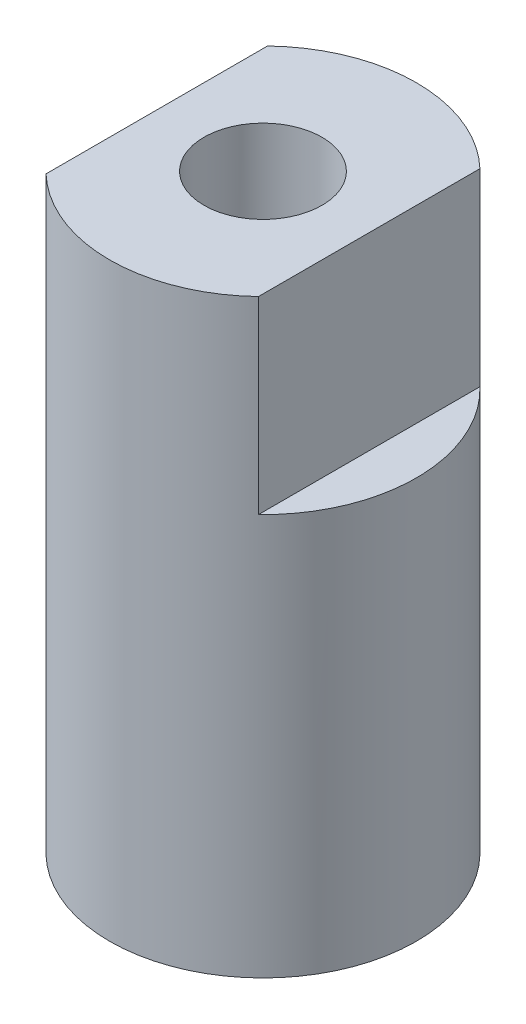
ISO-10303-21;
HEADER;
FILE_DESCRIPTION(('STEP AP214'),'2;1');
FILE_NAME('part.step','',(''),(''),'','','');
FILE_SCHEMA(('AUTOMOTIVE_DESIGN { 1 0 10303 214 1 1 1 1 }'));
ENDSEC;
DATA;
#1=APPLICATION_CONTEXT('core data for automotive mechanical design processes');
#2=APPLICATION_PROTOCOL_DEFINITION('international standard','automotive_design',2000,#1);
#3=PRODUCT_CONTEXT('',#1,'mechanical');
#4=PRODUCT('Part','Part','',(#3));
#5=PRODUCT_RELATED_PRODUCT_CATEGORY('part','',(#4));
#6=PRODUCT_DEFINITION_FORMATION('','',#4);
#7=PRODUCT_DEFINITION_CONTEXT('part definition',#1,'design');
#8=PRODUCT_DEFINITION('design','',#6,#7);
#9=PRODUCT_DEFINITION_SHAPE('','',#8);
#10=(LENGTH_UNIT() NAMED_UNIT(*) SI_UNIT(.MILLI.,.METRE.));
#11=(NAMED_UNIT(*) PLANE_ANGLE_UNIT() SI_UNIT($,.RADIAN.));
#12=(NAMED_UNIT(*) SI_UNIT($,.STERADIAN.) SOLID_ANGLE_UNIT());
#13=UNCERTAINTY_MEASURE_WITH_UNIT(LENGTH_MEASURE(1.E-05),#10,'distance_accuracy_value','');
#14=(GEOMETRIC_REPRESENTATION_CONTEXT(3) GLOBAL_UNCERTAINTY_ASSIGNED_CONTEXT((#13)) GLOBAL_UNIT_ASSIGNED_CONTEXT((#10,
#11,#12)) REPRESENTATION_CONTEXT('',''));
#15=CARTESIAN_POINT('',(0.,0.,0.));
#16=DIRECTION('',(0.,0.,1.));
#17=DIRECTION('',(1.,0.,0.));
#18=AXIS2_PLACEMENT_3D('',#15,#16,#17);
#19=CARTESIAN_POINT('',(0.,10.,0.));
#20=DIRECTION('',(0.,1.,0.));
#21=DIRECTION('',(0.,0.,1.));
#22=AXIS2_PLACEMENT_3D('',#19,#20,#21);
#23=CYLINDRICAL_SURFACE('',#22,0.999999999999999);
#24=CARTESIAN_POINT('',(0.,10.,0.));
#25=DIRECTION('',(0.,1.,0.));
#26=DIRECTION('',(0.,0.,1.));
#27=AXIS2_PLACEMENT_3D('',#24,#25,#26);
#28=CIRCLE('',#27,0.999999999999999);
#29=CARTESIAN_POINT('',(0.,10.,0.999999999999999));
#30=VERTEX_POINT('',#29);
#31=EDGE_CURVE('E107',#30,#30,#28,.T.);
#32=ORIENTED_EDGE('',*,*,#31,.T.);
#33=EDGE_LOOP('',(#32));
#34=FACE_BOUND('',#33,.T.);
#35=CARTESIAN_POINT('',(0.,8.,0.));
#36=DIRECTION('',(0.,-1.,0.));
#37=DIRECTION('',(0.,0.,-1.));
#38=AXIS2_PLACEMENT_3D('',#35,#36,#37);
#39=CIRCLE('',#38,0.999999999999999);
#40=CARTESIAN_POINT('',(0.,8.,-0.999999999999999));
#41=VERTEX_POINT('',#40);
#42=EDGE_CURVE('E43',#41,#41,#39,.F.);
#43=ORIENTED_EDGE('',*,*,#42,.F.);
#44=EDGE_LOOP('',(#43));
#45=FACE_BOUND('',#44,.T.);
#46=ADVANCED_FACE('F39',(#34,#45),#23,.F.);
#47=CARTESIAN_POINT('',(0.,10.,0.));
#48=DIRECTION('',(0.,-1.,0.));
#49=DIRECTION('',(0.,0.,-1.));
#50=AXIS2_PLACEMENT_3D('',#47,#48,#49);
#51=CYLINDRICAL_SURFACE('',#50,2.6);
#52=CARTESIAN_POINT('',(0.,10.,0.));
#53=DIRECTION('',(0.,1.,0.));
#54=DIRECTION('',(0.,0.,1.));
#55=AXIS2_PLACEMENT_3D('',#52,#53,#54);
#56=CIRCLE('',#55,2.6);
#57=CARTESIAN_POINT('',(-1.8,10.,1.87616630392937));
#58=VERTEX_POINT('',#57);
#59=CARTESIAN_POINT('',(1.8,10.,1.87616630392937));
#60=VERTEX_POINT('',#59);
#61=EDGE_CURVE('E48',#58,#60,#56,.T.);
#62=ORIENTED_EDGE('',*,*,#61,.F.);
#63=DIRECTION('',(0.,1.,0.));
#64=VECTOR('',#63,1.);
#65=CARTESIAN_POINT('',(-1.8,6.8,1.87616630392937));
#66=LINE('',#65,#64);
#67=CARTESIAN_POINT('',(-1.8,6.8,1.87616630392937));
#68=VERTEX_POINT('',#67);
#69=EDGE_CURVE('E56',#68,#58,#66,.T.);
#70=ORIENTED_EDGE('',*,*,#69,.F.);
#71=CARTESIAN_POINT('',(0.,6.8,0.));
#72=DIRECTION('',(0.,1.,0.));
#73=DIRECTION('',(0.,0.,1.));
#74=AXIS2_PLACEMENT_3D('',#71,#72,#73);
#75=CIRCLE('',#74,2.6);
#76=CARTESIAN_POINT('',(-1.8,6.8,-1.87616630392937));
#77=VERTEX_POINT('',#76);
#78=EDGE_CURVE('E84',#77,#68,#75,.T.);
#79=ORIENTED_EDGE('',*,*,#78,.F.);
#80=DIRECTION('',(0.,1.,0.));
#81=VECTOR('',#80,1.);
#82=CARTESIAN_POINT('',(-1.8,6.8,-1.87616630392937));
#83=LINE('',#82,#81);
#84=CARTESIAN_POINT('',(-1.8,10.,-1.87616630392937));
#85=VERTEX_POINT('',#84);
#86=EDGE_CURVE('E92',#77,#85,#83,.T.);
#87=ORIENTED_EDGE('',*,*,#86,.T.);
#88=CARTESIAN_POINT('',(1.8,10.,-1.87616630392937));
#89=VERTEX_POINT('',#88);
#90=EDGE_CURVE('E11',#89,#85,#56,.T.);
#91=ORIENTED_EDGE('',*,*,#90,.F.);
#92=DIRECTION('',(0.,1.,0.));
#93=VECTOR('',#92,1.);
#94=CARTESIAN_POINT('',(1.8,6.8,-1.87616630392937));
#95=LINE('',#94,#93);
#96=CARTESIAN_POINT('',(1.8,6.8,-1.87616630392937));
#97=VERTEX_POINT('',#96);
#98=EDGE_CURVE('E64',#97,#89,#95,.T.);
#99=ORIENTED_EDGE('',*,*,#98,.F.);
#100=CARTESIAN_POINT('',(0.,6.8,0.));
#101=DIRECTION('',(0.,1.,0.));
#102=DIRECTION('',(0.,0.,1.));
#103=AXIS2_PLACEMENT_3D('',#100,#101,#102);
#104=CIRCLE('',#103,2.6);
#105=CARTESIAN_POINT('',(1.8,6.8,1.87616630392937));
#106=VERTEX_POINT('',#105);
#107=EDGE_CURVE('E110',#106,#97,#104,.T.);
#108=ORIENTED_EDGE('',*,*,#107,.F.);
#109=DIRECTION('',(0.,1.,0.));
#110=VECTOR('',#109,1.);
#111=CARTESIAN_POINT('',(1.8,6.8,1.87616630392937));
#112=LINE('',#111,#110);
#113=EDGE_CURVE('E105',#106,#60,#112,.T.);
#114=ORIENTED_EDGE('',*,*,#113,.T.);
#115=EDGE_LOOP('',(#62,#70,#79,#87,#91,#99,#108,#114));
#116=FACE_BOUND('',#115,.T.);
#117=CARTESIAN_POINT('',(0.,0.,0.));
#118=DIRECTION('',(0.,1.,0.));
#119=DIRECTION('',(0.,0.,1.));
#120=AXIS2_PLACEMENT_3D('',#117,#118,#119);
#121=CIRCLE('',#120,2.6);
#122=CARTESIAN_POINT('',(0.,0.,2.6));
#123=VERTEX_POINT('',#122);
#124=EDGE_CURVE('E99',#123,#123,#121,.T.);
#125=ORIENTED_EDGE('',*,*,#124,.T.);
#126=EDGE_LOOP('',(#125));
#127=FACE_BOUND('',#126,.T.);
#128=ADVANCED_FACE('F41',(#116,#127),#51,.T.);
#129=CARTESIAN_POINT('',(0.,10.,0.));
#130=DIRECTION('',(0.,1.,0.));
#131=DIRECTION('',(0.,0.,1.));
#132=AXIS2_PLACEMENT_3D('',#129,#130,#131);
#133=PLANE('',#132);
#134=ORIENTED_EDGE('',*,*,#31,.F.);
#135=EDGE_LOOP('',(#134));
#136=FACE_BOUND('',#135,.T.);
#137=DIRECTION('',(0.,0.,-1.));
#138=VECTOR('',#137,1.);
#139=CARTESIAN_POINT('',(-1.8,10.,-1.87616630392937));
#140=LINE('',#139,#138);
#141=EDGE_CURVE('E89',#58,#85,#140,.T.);
#142=ORIENTED_EDGE('',*,*,#141,.F.);
#143=ORIENTED_EDGE('',*,*,#61,.T.);
#144=DIRECTION('',(0.,0.,1.));
#145=VECTOR('',#144,1.);
#146=CARTESIAN_POINT('',(1.8,10.,-1.87616630392937));
#147=LINE('',#146,#145);
#148=EDGE_CURVE('E108',#89,#60,#147,.T.);
#149=ORIENTED_EDGE('',*,*,#148,.F.);
#150=ORIENTED_EDGE('',*,*,#90,.T.);
#151=EDGE_LOOP('',(#142,#143,#149,#150));
#152=FACE_BOUND('',#151,.T.);
#153=ADVANCED_FACE('F119',(#136,#152),#133,.T.);
#154=CARTESIAN_POINT('',(0.,0.,0.));
#155=DIRECTION('',(0.,1.,0.));
#156=DIRECTION('',(0.,0.,1.));
#157=AXIS2_PLACEMENT_3D('',#154,#155,#156);
#158=PLANE('',#157);
#159=CARTESIAN_POINT('',(0.,0.,0.));
#160=DIRECTION('',(0.,-1.,0.));
#161=DIRECTION('',(0.,0.,-1.));
#162=AXIS2_PLACEMENT_3D('',#159,#160,#161);
#163=CIRCLE('',#162,1.55);
#164=CARTESIAN_POINT('',(0.,0.,-1.55));
#165=VERTEX_POINT('',#164);
#166=EDGE_CURVE('E157',#165,#165,#163,.T.);
#167=ORIENTED_EDGE('',*,*,#166,.F.);
#168=EDGE_LOOP('',(#167));
#169=FACE_BOUND('',#168,.T.);
#170=ORIENTED_EDGE('',*,*,#124,.F.);
#171=EDGE_LOOP('',(#170));
#172=FACE_BOUND('',#171,.T.);
#173=ADVANCED_FACE('F116',(#169,#172),#158,.F.);
#174=CARTESIAN_POINT('',(1.8,6.8,-1.87616630392937));
#175=DIRECTION('',(-1.,0.,0.));
#176=DIRECTION('',(0.,0.,1.));
#177=AXIS2_PLACEMENT_3D('',#174,#175,#176);
#178=PLANE('',#177);
#179=ORIENTED_EDGE('',*,*,#148,.T.);
#180=ORIENTED_EDGE('',*,*,#113,.F.);
#181=DIRECTION('',(0.,0.,1.));
#182=VECTOR('',#181,1.);
#183=CARTESIAN_POINT('',(1.8,6.8,-1.87616630392937));
#184=LINE('',#183,#182);
#185=EDGE_CURVE('E104',#97,#106,#184,.T.);
#186=ORIENTED_EDGE('',*,*,#185,.F.);
#187=ORIENTED_EDGE('',*,*,#98,.T.);
#188=EDGE_LOOP('',(#179,#180,#186,#187));
#189=FACE_BOUND('',#188,.T.);
#190=ADVANCED_FACE('F118',(#189),#178,.F.);
#191=CARTESIAN_POINT('',(0.,6.8,0.));
#192=DIRECTION('',(0.,1.,0.));
#193=DIRECTION('',(0.,0.,1.));
#194=AXIS2_PLACEMENT_3D('',#191,#192,#193);
#195=PLANE('',#194);
#196=ORIENTED_EDGE('',*,*,#107,.T.);
#197=ORIENTED_EDGE('',*,*,#185,.T.);
#198=EDGE_LOOP('',(#196,#197));
#199=FACE_BOUND('',#198,.T.);
#200=ADVANCED_FACE('F126',(#199),#195,.T.);
#201=CARTESIAN_POINT('',(-1.8,6.8,-1.87616630392937));
#202=DIRECTION('',(1.,0.,0.));
#203=DIRECTION('',(0.,0.,-1.));
#204=AXIS2_PLACEMENT_3D('',#201,#202,#203);
#205=PLANE('',#204);
#206=ORIENTED_EDGE('',*,*,#141,.T.);
#207=ORIENTED_EDGE('',*,*,#86,.F.);
#208=DIRECTION('',(0.,0.,-1.));
#209=VECTOR('',#208,1.);
#210=CARTESIAN_POINT('',(-1.8,6.8,-1.87616630392937));
#211=LINE('',#210,#209);
#212=EDGE_CURVE('E86',#68,#77,#211,.T.);
#213=ORIENTED_EDGE('',*,*,#212,.F.);
#214=ORIENTED_EDGE('',*,*,#69,.T.);
#215=EDGE_LOOP('',(#206,#207,#213,#214));
#216=FACE_BOUND('',#215,.T.);
#217=ADVANCED_FACE('F91',(#216),#205,.F.);
#218=CARTESIAN_POINT('',(0.,6.8,0.));
#219=DIRECTION('',(0.,1.,0.));
#220=DIRECTION('',(0.,0.,1.));
#221=AXIS2_PLACEMENT_3D('',#218,#219,#220);
#222=PLANE('',#221);
#223=ORIENTED_EDGE('',*,*,#78,.T.);
#224=ORIENTED_EDGE('',*,*,#212,.T.);
#225=EDGE_LOOP('',(#223,#224));
#226=FACE_BOUND('',#225,.T.);
#227=ADVANCED_FACE('F85',(#226),#222,.T.);
#228=CARTESIAN_POINT('',(0.,8.,0.));
#229=DIRECTION('',(0.,-1.,0.));
#230=DIRECTION('',(0.,0.,-1.));
#231=AXIS2_PLACEMENT_3D('',#228,#229,#230);
#232=PLANE('',#231);
#233=CARTESIAN_POINT('',(0.,8.,0.));
#234=DIRECTION('',(0.,-1.,0.));
#235=DIRECTION('',(0.,0.,-1.));
#236=AXIS2_PLACEMENT_3D('',#233,#234,#235);
#237=CIRCLE('',#236,1.55);
#238=CARTESIAN_POINT('',(0.,8.,-1.55));
#239=VERTEX_POINT('',#238);
#240=EDGE_CURVE('E160',#239,#239,#237,.T.);
#241=ORIENTED_EDGE('',*,*,#240,.T.);
#242=EDGE_LOOP('',(#241));
#243=FACE_BOUND('',#242,.T.);
#244=ORIENTED_EDGE('',*,*,#42,.T.);
#245=EDGE_LOOP('',(#244));
#246=FACE_BOUND('',#245,.T.);
#247=ADVANCED_FACE('F145',(#243,#246),#232,.T.);
#248=CARTESIAN_POINT('',(0.,8.,0.));
#249=DIRECTION('',(0.,-1.,0.));
#250=DIRECTION('',(0.,0.,-1.));
#251=AXIS2_PLACEMENT_3D('',#248,#249,#250);
#252=CYLINDRICAL_SURFACE('',#251,1.55);
#253=ORIENTED_EDGE('',*,*,#240,.F.);
#254=EDGE_LOOP('',(#253));
#255=FACE_BOUND('',#254,.T.);
#256=ORIENTED_EDGE('',*,*,#166,.T.);
#257=EDGE_LOOP('',(#256));
#258=FACE_BOUND('',#257,.T.);
#259=ADVANCED_FACE('F141',(#255,#258),#252,.F.);
#260=CLOSED_SHELL('',(#46,#128,#153,#173,#190,#200,#217,#227,#247,#259));
#261=MANIFOLD_SOLID_BREP('B2',#260);
#262=ADVANCED_BREP_SHAPE_REPRESENTATION('',(#18,#261),#14);
#263=SHAPE_DEFINITION_REPRESENTATION(#9,#262);
ENDSEC;
END-ISO-10303-21;
